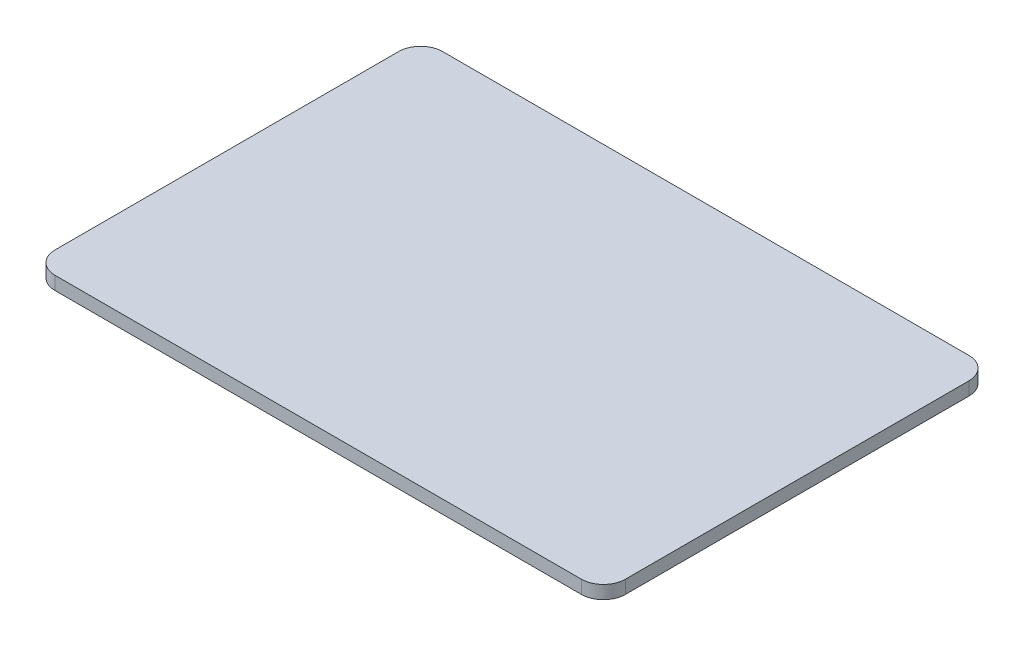
ISO-10303-21;
HEADER;
FILE_DESCRIPTION(('STEP AP214'),'2;1');
FILE_NAME('part.step','',(''),(''),'','','');
FILE_SCHEMA(('AUTOMOTIVE_DESIGN { 1 0 10303 214 1 1 1 1 }'));
ENDSEC;
DATA;
#1=APPLICATION_CONTEXT('core data for automotive mechanical design processes');
#2=APPLICATION_PROTOCOL_DEFINITION('international standard','automotive_design',2000,#1);
#3=PRODUCT_CONTEXT('',#1,'mechanical');
#4=PRODUCT('Part','Part','',(#3));
#5=PRODUCT_RELATED_PRODUCT_CATEGORY('part','',(#4));
#6=PRODUCT_DEFINITION_FORMATION('','',#4);
#7=PRODUCT_DEFINITION_CONTEXT('part definition',#1,'design');
#8=PRODUCT_DEFINITION('design','',#6,#7);
#9=PRODUCT_DEFINITION_SHAPE('','',#8);
#10=(LENGTH_UNIT() NAMED_UNIT(*) SI_UNIT(.MILLI.,.METRE.));
#11=(NAMED_UNIT(*) PLANE_ANGLE_UNIT() SI_UNIT($,.RADIAN.));
#12=(NAMED_UNIT(*) SI_UNIT($,.STERADIAN.) SOLID_ANGLE_UNIT());
#13=UNCERTAINTY_MEASURE_WITH_UNIT(LENGTH_MEASURE(1.E-05),#10,'distance_accuracy_value','');
#14=(GEOMETRIC_REPRESENTATION_CONTEXT(3) GLOBAL_UNCERTAINTY_ASSIGNED_CONTEXT((#13)) GLOBAL_UNIT_ASSIGNED_CONTEXT((#10,
#11,#12)) REPRESENTATION_CONTEXT('',''));
#15=CARTESIAN_POINT('',(0.,0.,0.));
#16=DIRECTION('',(0.,0.,1.));
#17=DIRECTION('',(1.,0.,0.));
#18=AXIS2_PLACEMENT_3D('',#15,#16,#17);
#19=CARTESIAN_POINT('',(129.5,6.,-88.));
#20=DIRECTION('',(-1.,0.,0.));
#21=DIRECTION('',(0.,0.,1.));
#22=AXIS2_PLACEMENT_3D('',#19,#20,#21);
#23=PLANE('',#22);
#24=DIRECTION('',(0.,0.,-1.));
#25=VECTOR('',#24,1.);
#26=CARTESIAN_POINT('',(129.5,0.,-88.));
#27=LINE('',#26,#25);
#28=CARTESIAN_POINT('',(129.5,0.,78.));
#29=VERTEX_POINT('',#28);
#30=CARTESIAN_POINT('',(129.5,0.,-78.));
#31=VERTEX_POINT('',#30);
#32=EDGE_CURVE('E141',#29,#31,#27,.T.);
#33=ORIENTED_EDGE('',*,*,#32,.T.);
#34=DIRECTION('',(0.,-1.,0.));
#35=VECTOR('',#34,1.);
#36=CARTESIAN_POINT('',(129.5,6.,-78.));
#37=LINE('',#36,#35);
#38=CARTESIAN_POINT('',(129.5,6.,-78.));
#39=VERTEX_POINT('',#38);
#40=EDGE_CURVE('E11',#31,#39,#37,.F.);
#41=ORIENTED_EDGE('',*,*,#40,.T.);
#42=DIRECTION('',(0.,0.,-1.));
#43=VECTOR('',#42,1.);
#44=CARTESIAN_POINT('',(129.5,6.,-88.));
#45=LINE('',#44,#43);
#46=CARTESIAN_POINT('',(129.5,6.,78.));
#47=VERTEX_POINT('',#46);
#48=EDGE_CURVE('E139',#47,#39,#45,.T.);
#49=ORIENTED_EDGE('',*,*,#48,.F.);
#50=DIRECTION('',(0.,-1.,0.));
#51=VECTOR('',#50,1.);
#52=CARTESIAN_POINT('',(129.5,6.,78.));
#53=LINE('',#52,#51);
#54=EDGE_CURVE('E53',#47,#29,#53,.T.);
#55=ORIENTED_EDGE('',*,*,#54,.T.);
#56=EDGE_LOOP('',(#33,#41,#49,#55));
#57=FACE_BOUND('',#56,.T.);
#58=ADVANCED_FACE('F45',(#57),#23,.F.);
#59=CARTESIAN_POINT('',(-129.5,6.,-88.));
#60=DIRECTION('',(0.,0.,1.));
#61=DIRECTION('',(1.,0.,0.));
#62=AXIS2_PLACEMENT_3D('',#59,#60,#61);
#63=PLANE('',#62);
#64=DIRECTION('',(-1.,0.,0.));
#65=VECTOR('',#64,1.);
#66=CARTESIAN_POINT('',(-129.5,0.,-88.));
#67=LINE('',#66,#65);
#68=CARTESIAN_POINT('',(119.5,0.,-88.));
#69=VERTEX_POINT('',#68);
#70=CARTESIAN_POINT('',(-119.5,0.,-88.));
#71=VERTEX_POINT('',#70);
#72=EDGE_CURVE('E137',#69,#71,#67,.T.);
#73=ORIENTED_EDGE('',*,*,#72,.T.);
#74=DIRECTION('',(0.,-1.,0.));
#75=VECTOR('',#74,1.);
#76=CARTESIAN_POINT('',(-119.5,6.,-88.));
#77=LINE('',#76,#75);
#78=CARTESIAN_POINT('',(-119.5,6.,-88.));
#79=VERTEX_POINT('',#78);
#80=EDGE_CURVE('E116',#71,#79,#77,.F.);
#81=ORIENTED_EDGE('',*,*,#80,.T.);
#82=DIRECTION('',(-1.,0.,0.));
#83=VECTOR('',#82,1.);
#84=CARTESIAN_POINT('',(-129.5,6.,-88.));
#85=LINE('',#84,#83);
#86=CARTESIAN_POINT('',(119.5,6.,-88.));
#87=VERTEX_POINT('',#86);
#88=EDGE_CURVE('E177',#87,#79,#85,.T.);
#89=ORIENTED_EDGE('',*,*,#88,.F.);
#90=DIRECTION('',(0.,-1.,0.));
#91=VECTOR('',#90,1.);
#92=CARTESIAN_POINT('',(119.5,6.,-88.));
#93=LINE('',#92,#91);
#94=EDGE_CURVE('E121',#87,#69,#93,.T.);
#95=ORIENTED_EDGE('',*,*,#94,.T.);
#96=EDGE_LOOP('',(#73,#81,#89,#95));
#97=FACE_BOUND('',#96,.T.);
#98=ADVANCED_FACE('F187',(#97),#63,.F.);
#99=CARTESIAN_POINT('',(-129.5,6.,-88.));
#100=DIRECTION('',(1.,0.,0.));
#101=DIRECTION('',(0.,0.,-1.));
#102=AXIS2_PLACEMENT_3D('',#99,#100,#101);
#103=PLANE('',#102);
#104=DIRECTION('',(0.,0.,1.));
#105=VECTOR('',#104,1.);
#106=CARTESIAN_POINT('',(-129.5,6.,-88.));
#107=LINE('',#106,#105);
#108=CARTESIAN_POINT('',(-129.5,6.,-78.));
#109=VERTEX_POINT('',#108);
#110=CARTESIAN_POINT('',(-129.5,6.,78.));
#111=VERTEX_POINT('',#110);
#112=EDGE_CURVE('E130',#109,#111,#107,.T.);
#113=ORIENTED_EDGE('',*,*,#112,.F.);
#114=DIRECTION('',(0.,-1.,0.));
#115=VECTOR('',#114,1.);
#116=CARTESIAN_POINT('',(-129.5,6.,-78.));
#117=LINE('',#116,#115);
#118=CARTESIAN_POINT('',(-129.5,0.,-78.));
#119=VERTEX_POINT('',#118);
#120=EDGE_CURVE('E115',#109,#119,#117,.T.);
#121=ORIENTED_EDGE('',*,*,#120,.T.);
#122=DIRECTION('',(0.,0.,1.));
#123=VECTOR('',#122,1.);
#124=CARTESIAN_POINT('',(-129.5,0.,-88.));
#125=LINE('',#124,#123);
#126=CARTESIAN_POINT('',(-129.5,0.,78.));
#127=VERTEX_POINT('',#126);
#128=EDGE_CURVE('E128',#119,#127,#125,.T.);
#129=ORIENTED_EDGE('',*,*,#128,.T.);
#130=DIRECTION('',(0.,-1.,0.));
#131=VECTOR('',#130,1.);
#132=CARTESIAN_POINT('',(-129.5,6.,78.));
#133=LINE('',#132,#131);
#134=EDGE_CURVE('E132',#127,#111,#133,.F.);
#135=ORIENTED_EDGE('',*,*,#134,.T.);
#136=EDGE_LOOP('',(#113,#121,#129,#135));
#137=FACE_BOUND('',#136,.T.);
#138=ADVANCED_FACE('F127',(#137),#103,.F.);
#139=CARTESIAN_POINT('',(-129.5,6.,88.));
#140=DIRECTION('',(0.,0.,-1.));
#141=DIRECTION('',(-1.,0.,0.));
#142=AXIS2_PLACEMENT_3D('',#139,#140,#141);
#143=PLANE('',#142);
#144=DIRECTION('',(1.,0.,0.));
#145=VECTOR('',#144,1.);
#146=CARTESIAN_POINT('',(-129.5,6.,88.));
#147=LINE('',#146,#145);
#148=CARTESIAN_POINT('',(-119.5,6.,88.));
#149=VERTEX_POINT('',#148);
#150=CARTESIAN_POINT('',(119.5,6.,88.));
#151=VERTEX_POINT('',#150);
#152=EDGE_CURVE('E145',#149,#151,#147,.T.);
#153=ORIENTED_EDGE('',*,*,#152,.F.);
#154=DIRECTION('',(0.,-1.,0.));
#155=VECTOR('',#154,1.);
#156=CARTESIAN_POINT('',(-119.5,6.,88.));
#157=LINE('',#156,#155);
#158=CARTESIAN_POINT('',(-119.5,0.,88.));
#159=VERTEX_POINT('',#158);
#160=EDGE_CURVE('E162',#149,#159,#157,.T.);
#161=ORIENTED_EDGE('',*,*,#160,.T.);
#162=DIRECTION('',(1.,0.,0.));
#163=VECTOR('',#162,1.);
#164=CARTESIAN_POINT('',(-129.5,0.,88.));
#165=LINE('',#164,#163);
#166=CARTESIAN_POINT('',(119.5,0.,88.));
#167=VERTEX_POINT('',#166);
#168=EDGE_CURVE('E136',#159,#167,#165,.T.);
#169=ORIENTED_EDGE('',*,*,#168,.T.);
#170=DIRECTION('',(0.,-1.,0.));
#171=VECTOR('',#170,1.);
#172=CARTESIAN_POINT('',(119.5,6.,88.));
#173=LINE('',#172,#171);
#174=EDGE_CURVE('E60',#167,#151,#173,.F.);
#175=ORIENTED_EDGE('',*,*,#174,.T.);
#176=EDGE_LOOP('',(#153,#161,#169,#175));
#177=FACE_BOUND('',#176,.T.);
#178=ADVANCED_FACE('F191',(#177),#143,.F.);
#179=CARTESIAN_POINT('',(0.,6.,0.));
#180=DIRECTION('',(0.,1.,0.));
#181=DIRECTION('',(0.,0.,1.));
#182=AXIS2_PLACEMENT_3D('',#179,#180,#181);
#183=PLANE('',#182);
#184=ORIENTED_EDGE('',*,*,#88,.T.);
#185=CARTESIAN_POINT('',(-119.5,6.,-78.));
#186=DIRECTION('',(0.,1.,0.));
#187=DIRECTION('',(0.,0.,1.));
#188=AXIS2_PLACEMENT_3D('',#185,#186,#187);
#189=CIRCLE('',#188,10.);
#190=EDGE_CURVE('E159',#79,#109,#189,.T.);
#191=ORIENTED_EDGE('',*,*,#190,.T.);
#192=ORIENTED_EDGE('',*,*,#112,.T.);
#193=CARTESIAN_POINT('',(-119.5,6.,78.));
#194=DIRECTION('',(0.,1.,0.));
#195=DIRECTION('',(0.,0.,1.));
#196=AXIS2_PLACEMENT_3D('',#193,#194,#195);
#197=CIRCLE('',#196,10.);
#198=EDGE_CURVE('E67',#111,#149,#197,.T.);
#199=ORIENTED_EDGE('',*,*,#198,.T.);
#200=ORIENTED_EDGE('',*,*,#152,.T.);
#201=CARTESIAN_POINT('',(119.5,6.,78.));
#202=DIRECTION('',(0.,1.,0.));
#203=DIRECTION('',(0.,0.,1.));
#204=AXIS2_PLACEMENT_3D('',#201,#202,#203);
#205=CIRCLE('',#204,10.);
#206=EDGE_CURVE('E154',#151,#47,#205,.T.);
#207=ORIENTED_EDGE('',*,*,#206,.T.);
#208=ORIENTED_EDGE('',*,*,#48,.T.);
#209=CARTESIAN_POINT('',(119.5,6.,-78.));
#210=DIRECTION('',(0.,1.,0.));
#211=DIRECTION('',(0.,0.,1.));
#212=AXIS2_PLACEMENT_3D('',#209,#210,#211);
#213=CIRCLE('',#212,10.);
#214=EDGE_CURVE('E156',#39,#87,#213,.T.);
#215=ORIENTED_EDGE('',*,*,#214,.T.);
#216=EDGE_LOOP('',(#184,#191,#192,#199,#200,#207,#208,#215));
#217=FACE_BOUND('',#216,.T.);
#218=ADVANCED_FACE('F181',(#217),#183,.T.);
#219=CARTESIAN_POINT('',(0.,0.,0.));
#220=DIRECTION('',(0.,1.,0.));
#221=DIRECTION('',(0.,0.,1.));
#222=AXIS2_PLACEMENT_3D('',#219,#220,#221);
#223=PLANE('',#222);
#224=ORIENTED_EDGE('',*,*,#128,.F.);
#225=CARTESIAN_POINT('',(-119.5,0.,-78.));
#226=DIRECTION('',(0.,1.,0.));
#227=DIRECTION('',(0.,0.,1.));
#228=AXIS2_PLACEMENT_3D('',#225,#226,#227);
#229=CIRCLE('',#228,10.);
#230=EDGE_CURVE('E111',#119,#71,#229,.F.);
#231=ORIENTED_EDGE('',*,*,#230,.T.);
#232=ORIENTED_EDGE('',*,*,#72,.F.);
#233=CARTESIAN_POINT('',(119.5,0.,-78.));
#234=DIRECTION('',(0.,1.,0.));
#235=DIRECTION('',(0.,0.,1.));
#236=AXIS2_PLACEMENT_3D('',#233,#234,#235);
#237=CIRCLE('',#236,10.);
#238=EDGE_CURVE('E148',#69,#31,#237,.F.);
#239=ORIENTED_EDGE('',*,*,#238,.T.);
#240=ORIENTED_EDGE('',*,*,#32,.F.);
#241=CARTESIAN_POINT('',(119.5,0.,78.));
#242=DIRECTION('',(0.,1.,0.));
#243=DIRECTION('',(0.,0.,1.));
#244=AXIS2_PLACEMENT_3D('',#241,#242,#243);
#245=CIRCLE('',#244,10.);
#246=EDGE_CURVE('E131',#29,#167,#245,.F.);
#247=ORIENTED_EDGE('',*,*,#246,.T.);
#248=ORIENTED_EDGE('',*,*,#168,.F.);
#249=CARTESIAN_POINT('',(-119.5,0.,78.));
#250=DIRECTION('',(0.,1.,0.));
#251=DIRECTION('',(0.,0.,1.));
#252=AXIS2_PLACEMENT_3D('',#249,#250,#251);
#253=CIRCLE('',#252,10.);
#254=EDGE_CURVE('E122',#159,#127,#253,.F.);
#255=ORIENTED_EDGE('',*,*,#254,.T.);
#256=EDGE_LOOP('',(#224,#231,#232,#239,#240,#247,#248,#255));
#257=FACE_BOUND('',#256,.T.);
#258=ADVANCED_FACE('F134',(#257),#223,.F.);
#259=CARTESIAN_POINT('',(-119.5,6.,-78.));
#260=DIRECTION('',(0.,-1.,0.));
#261=DIRECTION('',(0.,0.,-1.));
#262=AXIS2_PLACEMENT_3D('',#259,#260,#261);
#263=CYLINDRICAL_SURFACE('',#262,10.);
#264=ORIENTED_EDGE('',*,*,#190,.F.);
#265=ORIENTED_EDGE('',*,*,#80,.F.);
#266=ORIENTED_EDGE('',*,*,#230,.F.);
#267=ORIENTED_EDGE('',*,*,#120,.F.);
#268=EDGE_LOOP('',(#264,#265,#266,#267));
#269=FACE_BOUND('',#268,.T.);
#270=ADVANCED_FACE('F114',(#269),#263,.T.);
#271=CARTESIAN_POINT('',(-119.5,6.,78.));
#272=DIRECTION('',(0.,-1.,0.));
#273=DIRECTION('',(0.,0.,-1.));
#274=AXIS2_PLACEMENT_3D('',#271,#272,#273);
#275=CYLINDRICAL_SURFACE('',#274,10.);
#276=ORIENTED_EDGE('',*,*,#198,.F.);
#277=ORIENTED_EDGE('',*,*,#134,.F.);
#278=ORIENTED_EDGE('',*,*,#254,.F.);
#279=ORIENTED_EDGE('',*,*,#160,.F.);
#280=EDGE_LOOP('',(#276,#277,#278,#279));
#281=FACE_BOUND('',#280,.T.);
#282=ADVANCED_FACE('F190',(#281),#275,.T.);
#283=CARTESIAN_POINT('',(119.5,6.,-78.));
#284=DIRECTION('',(0.,-1.,0.));
#285=DIRECTION('',(0.,0.,-1.));
#286=AXIS2_PLACEMENT_3D('',#283,#284,#285);
#287=CYLINDRICAL_SURFACE('',#286,10.);
#288=ORIENTED_EDGE('',*,*,#214,.F.);
#289=ORIENTED_EDGE('',*,*,#40,.F.);
#290=ORIENTED_EDGE('',*,*,#238,.F.);
#291=ORIENTED_EDGE('',*,*,#94,.F.);
#292=EDGE_LOOP('',(#288,#289,#290,#291));
#293=FACE_BOUND('',#292,.T.);
#294=ADVANCED_FACE('F185',(#293),#287,.T.);
#295=CARTESIAN_POINT('',(119.5,6.,78.));
#296=DIRECTION('',(0.,-1.,0.));
#297=DIRECTION('',(0.,0.,-1.));
#298=AXIS2_PLACEMENT_3D('',#295,#296,#297);
#299=CYLINDRICAL_SURFACE('',#298,10.);
#300=ORIENTED_EDGE('',*,*,#206,.F.);
#301=ORIENTED_EDGE('',*,*,#174,.F.);
#302=ORIENTED_EDGE('',*,*,#246,.F.);
#303=ORIENTED_EDGE('',*,*,#54,.F.);
#304=EDGE_LOOP('',(#300,#301,#302,#303));
#305=FACE_BOUND('',#304,.T.);
#306=ADVANCED_FACE('F47',(#305),#299,.T.);
#307=CLOSED_SHELL('',(#58,#98,#138,#178,#218,#258,#270,#282,#294,#306));
#308=MANIFOLD_SOLID_BREP('B2',#307);
#309=ADVANCED_BREP_SHAPE_REPRESENTATION('',(#18,#308),#14);
#310=SHAPE_DEFINITION_REPRESENTATION(#9,#309);
ENDSEC;
END-ISO-10303-21;
